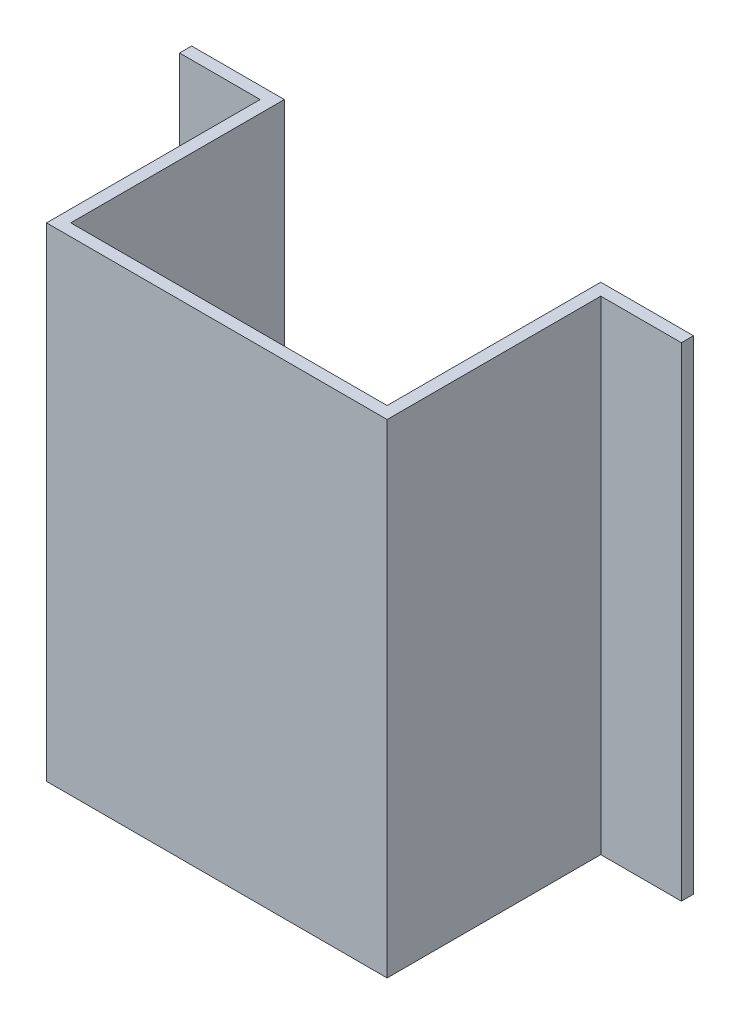
ISO-10303-21;
HEADER;
FILE_DESCRIPTION(('STEP AP214'),'2;1');
FILE_NAME('part.step','',(''),(''),'','','');
FILE_SCHEMA(('AUTOMOTIVE_DESIGN { 1 0 10303 214 1 1 1 1 }'));
ENDSEC;
DATA;
#1=APPLICATION_CONTEXT('core data for automotive mechanical design processes');
#2=APPLICATION_PROTOCOL_DEFINITION('international standard','automotive_design',2000,#1);
#3=PRODUCT_CONTEXT('',#1,'mechanical');
#4=PRODUCT('Part','Part','',(#3));
#5=PRODUCT_RELATED_PRODUCT_CATEGORY('part','',(#4));
#6=PRODUCT_DEFINITION_FORMATION('','',#4);
#7=PRODUCT_DEFINITION_CONTEXT('part definition',#1,'design');
#8=PRODUCT_DEFINITION('design','',#6,#7);
#9=PRODUCT_DEFINITION_SHAPE('','',#8);
#10=(LENGTH_UNIT() NAMED_UNIT(*) SI_UNIT(.MILLI.,.METRE.));
#11=(NAMED_UNIT(*) PLANE_ANGLE_UNIT() SI_UNIT($,.RADIAN.));
#12=(NAMED_UNIT(*) SI_UNIT($,.STERADIAN.) SOLID_ANGLE_UNIT());
#13=UNCERTAINTY_MEASURE_WITH_UNIT(LENGTH_MEASURE(1.E-05),#10,'distance_accuracy_value','');
#14=(GEOMETRIC_REPRESENTATION_CONTEXT(3) GLOBAL_UNCERTAINTY_ASSIGNED_CONTEXT((#13)) GLOBAL_UNIT_ASSIGNED_CONTEXT((#10,
#11,#12)) REPRESENTATION_CONTEXT('',''));
#15=CARTESIAN_POINT('',(0.,0.,0.));
#16=DIRECTION('',(0.,0.,1.));
#17=DIRECTION('',(1.,0.,0.));
#18=AXIS2_PLACEMENT_3D('',#15,#16,#17);
#19=CARTESIAN_POINT('',(-42.25,60.,56.));
#20=DIRECTION('',(1.,0.,0.));
#21=DIRECTION('',(0.,1.,0.));
#22=AXIS2_PLACEMENT_3D('',#19,#20,#21);
#23=PLANE('',#22);
#24=DIRECTION('',(0.,1.,0.));
#25=VECTOR('',#24,1.);
#26=CARTESIAN_POINT('',(-42.25,60.,3.));
#27=LINE('',#26,#25);
#28=CARTESIAN_POINT('',(-42.25,-60.,3.00000000000001));
#29=VERTEX_POINT('',#28);
#30=CARTESIAN_POINT('',(-42.25,60.,3.));
#31=VERTEX_POINT('',#30);
#32=EDGE_CURVE('E57',#29,#31,#27,.T.);
#33=ORIENTED_EDGE('',*,*,#32,.F.);
#34=DIRECTION('',(0.,0.,-1.));
#35=VECTOR('',#34,1.);
#36=CARTESIAN_POINT('',(-42.25,-60.,56.));
#37=LINE('',#36,#35);
#38=CARTESIAN_POINT('',(-42.25,-60.,56.));
#39=VERTEX_POINT('',#38);
#40=EDGE_CURVE('E215',#39,#29,#37,.T.);
#41=ORIENTED_EDGE('',*,*,#40,.F.);
#42=DIRECTION('',(0.,-1.,0.));
#43=VECTOR('',#42,1.);
#44=CARTESIAN_POINT('',(-42.25,60.,56.));
#45=LINE('',#44,#43);
#46=CARTESIAN_POINT('',(-42.25,60.,56.));
#47=VERTEX_POINT('',#46);
#48=EDGE_CURVE('E206',#47,#39,#45,.T.);
#49=ORIENTED_EDGE('',*,*,#48,.F.);
#50=DIRECTION('',(0.,0.,-1.));
#51=VECTOR('',#50,1.);
#52=CARTESIAN_POINT('',(-42.25,60.,56.));
#53=LINE('',#52,#51);
#54=EDGE_CURVE('E42',#47,#31,#53,.T.);
#55=ORIENTED_EDGE('',*,*,#54,.T.);
#56=EDGE_LOOP('',(#33,#41,#49,#55));
#57=FACE_BOUND('',#56,.T.);
#58=ADVANCED_FACE('F34',(#57),#23,.F.);
#59=CARTESIAN_POINT('',(0.,0.,0.));
#60=DIRECTION('',(0.,0.,1.));
#61=DIRECTION('',(1.,0.,0.));
#62=AXIS2_PLACEMENT_3D('',#59,#60,#61);
#63=PLANE('',#62);
#64=DIRECTION('',(-1.,0.,0.));
#65=VECTOR('',#64,1.);
#66=CARTESIAN_POINT('',(-42.25,60.,0.));
#67=LINE('',#66,#65);
#68=CARTESIAN_POINT('',(-39.25,60.,0.));
#69=VERTEX_POINT('',#68);
#70=CARTESIAN_POINT('',(-62.25,60.,0.));
#71=VERTEX_POINT('',#70);
#72=EDGE_CURVE('E137',#69,#71,#67,.T.);
#73=ORIENTED_EDGE('',*,*,#72,.F.);
#74=DIRECTION('',(0.,1.,0.));
#75=VECTOR('',#74,1.);
#76=CARTESIAN_POINT('',(-39.25,-60.,0.));
#77=LINE('',#76,#75);
#78=CARTESIAN_POINT('',(-39.25,-60.,0.));
#79=VERTEX_POINT('',#78);
#80=EDGE_CURVE('E194',#79,#69,#77,.T.);
#81=ORIENTED_EDGE('',*,*,#80,.F.);
#82=DIRECTION('',(1.,0.,0.));
#83=VECTOR('',#82,1.);
#84=CARTESIAN_POINT('',(-42.25,-60.,0.));
#85=LINE('',#84,#83);
#86=CARTESIAN_POINT('',(-62.25,-60.,0.));
#87=VERTEX_POINT('',#86);
#88=EDGE_CURVE('E204',#87,#79,#85,.T.);
#89=ORIENTED_EDGE('',*,*,#88,.F.);
#90=DIRECTION('',(0.,-1.,0.));
#91=VECTOR('',#90,1.);
#92=CARTESIAN_POINT('',(-62.25,60.,0.));
#93=LINE('',#92,#91);
#94=EDGE_CURVE('E159',#71,#87,#93,.T.);
#95=ORIENTED_EDGE('',*,*,#94,.F.);
#96=EDGE_LOOP('',(#73,#81,#89,#95));
#97=FACE_BOUND('',#96,.T.);
#98=ADVANCED_FACE('F230',(#97),#63,.F.);
#99=CARTESIAN_POINT('',(42.25,60.,56.));
#100=DIRECTION('',(-1.,0.,0.));
#101=DIRECTION('',(0.,-1.,0.));
#102=AXIS2_PLACEMENT_3D('',#99,#100,#101);
#103=PLANE('',#102);
#104=DIRECTION('',(0.,0.,-1.));
#105=VECTOR('',#104,1.);
#106=CARTESIAN_POINT('',(42.25,-60.,56.));
#107=LINE('',#106,#105);
#108=CARTESIAN_POINT('',(42.25,-60.,56.));
#109=VERTEX_POINT('',#108);
#110=CARTESIAN_POINT('',(42.25,-60.,3.00000000000002));
#111=VERTEX_POINT('',#110);
#112=EDGE_CURVE('E209',#109,#111,#107,.T.);
#113=ORIENTED_EDGE('',*,*,#112,.T.);
#114=DIRECTION('',(0.,1.,0.));
#115=VECTOR('',#114,1.);
#116=CARTESIAN_POINT('',(42.25,60.,3.));
#117=LINE('',#116,#115);
#118=CARTESIAN_POINT('',(42.25,60.,3.00000000000001));
#119=VERTEX_POINT('',#118);
#120=EDGE_CURVE('E146',#111,#119,#117,.T.);
#121=ORIENTED_EDGE('',*,*,#120,.T.);
#122=DIRECTION('',(0.,0.,-1.));
#123=VECTOR('',#122,1.);
#124=CARTESIAN_POINT('',(42.25,60.,56.));
#125=LINE('',#124,#123);
#126=CARTESIAN_POINT('',(42.25,60.,56.));
#127=VERTEX_POINT('',#126);
#128=EDGE_CURVE('E11',#127,#119,#125,.T.);
#129=ORIENTED_EDGE('',*,*,#128,.F.);
#130=DIRECTION('',(0.,1.,0.));
#131=VECTOR('',#130,1.);
#132=CARTESIAN_POINT('',(42.25,60.,56.));
#133=LINE('',#132,#131);
#134=EDGE_CURVE('E200',#109,#127,#133,.T.);
#135=ORIENTED_EDGE('',*,*,#134,.F.);
#136=EDGE_LOOP('',(#113,#121,#129,#135));
#137=FACE_BOUND('',#136,.T.);
#138=ADVANCED_FACE('F36',(#137),#103,.F.);
#139=CARTESIAN_POINT('',(-42.25,60.,56.));
#140=DIRECTION('',(0.,-1.,0.));
#141=DIRECTION('',(0.,0.,-1.));
#142=AXIS2_PLACEMENT_3D('',#139,#140,#141);
#143=PLANE('',#142);
#144=DIRECTION('',(1.,0.,0.));
#145=VECTOR('',#144,1.);
#146=CARTESIAN_POINT('',(-39.25,60.,53.));
#147=LINE('',#146,#145);
#148=CARTESIAN_POINT('',(-39.25,60.,53.));
#149=VERTEX_POINT('',#148);
#150=CARTESIAN_POINT('',(39.25,60.,53.));
#151=VERTEX_POINT('',#150);
#152=EDGE_CURVE('E190',#149,#151,#147,.T.);
#153=ORIENTED_EDGE('',*,*,#152,.F.);
#154=DIRECTION('',(0.,0.,1.));
#155=VECTOR('',#154,1.);
#156=CARTESIAN_POINT('',(-39.25,60.,0.));
#157=LINE('',#156,#155);
#158=EDGE_CURVE('E176',#69,#149,#157,.T.);
#159=ORIENTED_EDGE('',*,*,#158,.F.);
#160=ORIENTED_EDGE('',*,*,#72,.T.);
#161=DIRECTION('',(0.,0.,-1.));
#162=VECTOR('',#161,1.);
#163=CARTESIAN_POINT('',(-62.25,60.,0.));
#164=LINE('',#163,#162);
#165=CARTESIAN_POINT('',(-62.25,60.,3.));
#166=VERTEX_POINT('',#165);
#167=EDGE_CURVE('E166',#166,#71,#164,.T.);
#168=ORIENTED_EDGE('',*,*,#167,.F.);
#169=DIRECTION('',(1.,0.,0.));
#170=VECTOR('',#169,1.);
#171=CARTESIAN_POINT('',(-62.25,60.,3.));
#172=LINE('',#171,#170);
#173=EDGE_CURVE('E169',#166,#31,#172,.T.);
#174=ORIENTED_EDGE('',*,*,#173,.T.);
#175=ORIENTED_EDGE('',*,*,#54,.F.);
#176=DIRECTION('',(-1.,0.,0.));
#177=VECTOR('',#176,1.);
#178=CARTESIAN_POINT('',(-42.25,60.,56.));
#179=LINE('',#178,#177);
#180=EDGE_CURVE('E203',#127,#47,#179,.T.);
#181=ORIENTED_EDGE('',*,*,#180,.F.);
#182=ORIENTED_EDGE('',*,*,#128,.T.);
#183=DIRECTION('',(-1.,0.,0.));
#184=VECTOR('',#183,1.);
#185=CARTESIAN_POINT('',(62.25,60.,3.));
#186=LINE('',#185,#184);
#187=CARTESIAN_POINT('',(62.25,60.,3.));
#188=VERTEX_POINT('',#187);
#189=EDGE_CURVE('E49',#188,#119,#186,.T.);
#190=ORIENTED_EDGE('',*,*,#189,.F.);
#191=DIRECTION('',(0.,0.,-1.));
#192=VECTOR('',#191,1.);
#193=CARTESIAN_POINT('',(62.25,60.,0.));
#194=LINE('',#193,#192);
#195=CARTESIAN_POINT('',(62.25,60.,0.));
#196=VERTEX_POINT('',#195);
#197=EDGE_CURVE('E143',#188,#196,#194,.T.);
#198=ORIENTED_EDGE('',*,*,#197,.T.);
#199=CARTESIAN_POINT('',(39.25,60.,0.));
#200=VERTEX_POINT('',#199);
#201=EDGE_CURVE('E126',#196,#200,#67,.T.);
#202=ORIENTED_EDGE('',*,*,#201,.T.);
#203=DIRECTION('',(0.,0.,-1.));
#204=VECTOR('',#203,1.);
#205=CARTESIAN_POINT('',(39.25,60.,0.));
#206=LINE('',#205,#204);
#207=EDGE_CURVE('E181',#151,#200,#206,.T.);
#208=ORIENTED_EDGE('',*,*,#207,.F.);
#209=EDGE_LOOP('',(#153,#159,#160,#168,#174,#175,#181,#182,#190,#198,#202,#208));
#210=FACE_BOUND('',#209,.T.);
#211=ADVANCED_FACE('F149',(#210),#143,.F.);
#212=CARTESIAN_POINT('',(-42.25,-60.,56.));
#213=DIRECTION('',(0.,1.,0.));
#214=DIRECTION('',(0.,0.,1.));
#215=AXIS2_PLACEMENT_3D('',#212,#213,#214);
#216=PLANE('',#215);
#217=ORIENTED_EDGE('',*,*,#88,.T.);
#218=DIRECTION('',(0.,0.,1.));
#219=VECTOR('',#218,1.);
#220=CARTESIAN_POINT('',(-39.25,-60.,0.));
#221=LINE('',#220,#219);
#222=CARTESIAN_POINT('',(-39.25,-60.,53.));
#223=VERTEX_POINT('',#222);
#224=EDGE_CURVE('E177',#79,#223,#221,.T.);
#225=ORIENTED_EDGE('',*,*,#224,.T.);
#226=DIRECTION('',(1.,0.,0.));
#227=VECTOR('',#226,1.);
#228=CARTESIAN_POINT('',(-39.25,-60.,53.));
#229=LINE('',#228,#227);
#230=CARTESIAN_POINT('',(39.25,-60.,53.));
#231=VERTEX_POINT('',#230);
#232=EDGE_CURVE('E180',#223,#231,#229,.T.);
#233=ORIENTED_EDGE('',*,*,#232,.T.);
#234=DIRECTION('',(0.,0.,-1.));
#235=VECTOR('',#234,1.);
#236=CARTESIAN_POINT('',(39.25,-60.,0.));
#237=LINE('',#236,#235);
#238=CARTESIAN_POINT('',(39.25,-60.,0.));
#239=VERTEX_POINT('',#238);
#240=EDGE_CURVE('E184',#231,#239,#237,.T.);
#241=ORIENTED_EDGE('',*,*,#240,.T.);
#242=CARTESIAN_POINT('',(62.25,-60.,0.));
#243=VERTEX_POINT('',#242);
#244=EDGE_CURVE('E136',#239,#243,#85,.T.);
#245=ORIENTED_EDGE('',*,*,#244,.T.);
#246=DIRECTION('',(0.,0.,1.));
#247=VECTOR('',#246,1.);
#248=CARTESIAN_POINT('',(62.25,-60.,0.));
#249=LINE('',#248,#247);
#250=CARTESIAN_POINT('',(62.25,-60.,3.00000000000002));
#251=VERTEX_POINT('',#250);
#252=EDGE_CURVE('E145',#243,#251,#249,.T.);
#253=ORIENTED_EDGE('',*,*,#252,.T.);
#254=DIRECTION('',(-1.,0.,0.));
#255=VECTOR('',#254,1.);
#256=CARTESIAN_POINT('',(62.25,-60.,3.00000000000002));
#257=LINE('',#256,#255);
#258=EDGE_CURVE('E155',#251,#111,#257,.T.);
#259=ORIENTED_EDGE('',*,*,#258,.T.);
#260=ORIENTED_EDGE('',*,*,#112,.F.);
#261=DIRECTION('',(1.,0.,0.));
#262=VECTOR('',#261,1.);
#263=CARTESIAN_POINT('',(-42.25,-60.,56.));
#264=LINE('',#263,#262);
#265=EDGE_CURVE('E208',#39,#109,#264,.T.);
#266=ORIENTED_EDGE('',*,*,#265,.F.);
#267=ORIENTED_EDGE('',*,*,#40,.T.);
#268=DIRECTION('',(1.,0.,0.));
#269=VECTOR('',#268,1.);
#270=CARTESIAN_POINT('',(-62.25,-60.,3.00000000000002));
#271=LINE('',#270,#269);
#272=CARTESIAN_POINT('',(-62.25,-60.,3.00000000000002));
#273=VERTEX_POINT('',#272);
#274=EDGE_CURVE('E173',#273,#29,#271,.T.);
#275=ORIENTED_EDGE('',*,*,#274,.F.);
#276=DIRECTION('',(0.,0.,1.));
#277=VECTOR('',#276,1.);
#278=CARTESIAN_POINT('',(-62.25,-60.,0.));
#279=LINE('',#278,#277);
#280=EDGE_CURVE('E162',#87,#273,#279,.T.);
#281=ORIENTED_EDGE('',*,*,#280,.F.);
#282=EDGE_LOOP('',(#217,#225,#233,#241,#245,#253,#259,#260,#266,#267,#275,#281));
#283=FACE_BOUND('',#282,.T.);
#284=ADVANCED_FACE('F234',(#283),#216,.F.);
#285=CARTESIAN_POINT('',(0.,0.,56.));
#286=DIRECTION('',(0.,0.,1.));
#287=DIRECTION('',(1.,0.,0.));
#288=AXIS2_PLACEMENT_3D('',#285,#286,#287);
#289=PLANE('',#288);
#290=ORIENTED_EDGE('',*,*,#134,.T.);
#291=ORIENTED_EDGE('',*,*,#180,.T.);
#292=ORIENTED_EDGE('',*,*,#48,.T.);
#293=ORIENTED_EDGE('',*,*,#265,.T.);
#294=EDGE_LOOP('',(#290,#291,#292,#293));
#295=FACE_BOUND('',#294,.T.);
#296=ADVANCED_FACE('F239',(#295),#289,.T.);
#297=ORIENTED_EDGE('',*,*,#244,.F.);
#298=DIRECTION('',(0.,1.,0.));
#299=VECTOR('',#298,1.);
#300=CARTESIAN_POINT('',(39.25,-60.,0.));
#301=LINE('',#300,#299);
#302=EDGE_CURVE('E132',#239,#200,#301,.T.);
#303=ORIENTED_EDGE('',*,*,#302,.T.);
#304=ORIENTED_EDGE('',*,*,#201,.F.);
#305=DIRECTION('',(0.,-1.,0.));
#306=VECTOR('',#305,1.);
#307=CARTESIAN_POINT('',(62.25,60.,0.));
#308=LINE('',#307,#306);
#309=EDGE_CURVE('E130',#196,#243,#308,.T.);
#310=ORIENTED_EDGE('',*,*,#309,.T.);
#311=EDGE_LOOP('',(#297,#303,#304,#310));
#312=FACE_BOUND('',#311,.T.);
#313=ADVANCED_FACE('F129',(#312),#63,.F.);
#314=CARTESIAN_POINT('',(-39.25,-60.,0.));
#315=DIRECTION('',(-1.,0.,0.));
#316=DIRECTION('',(0.,0.,1.));
#317=AXIS2_PLACEMENT_3D('',#314,#315,#316);
#318=PLANE('',#317);
#319=ORIENTED_EDGE('',*,*,#158,.T.);
#320=DIRECTION('',(0.,1.,0.));
#321=VECTOR('',#320,1.);
#322=CARTESIAN_POINT('',(-39.25,-60.,53.));
#323=LINE('',#322,#321);
#324=EDGE_CURVE('E187',#223,#149,#323,.T.);
#325=ORIENTED_EDGE('',*,*,#324,.F.);
#326=ORIENTED_EDGE('',*,*,#224,.F.);
#327=ORIENTED_EDGE('',*,*,#80,.T.);
#328=EDGE_LOOP('',(#319,#325,#326,#327));
#329=FACE_BOUND('',#328,.T.);
#330=ADVANCED_FACE('F250',(#329),#318,.F.);
#331=CARTESIAN_POINT('',(39.25,-60.,0.));
#332=DIRECTION('',(1.,0.,0.));
#333=DIRECTION('',(0.,0.,-1.));
#334=AXIS2_PLACEMENT_3D('',#331,#332,#333);
#335=PLANE('',#334);
#336=ORIENTED_EDGE('',*,*,#207,.T.);
#337=ORIENTED_EDGE('',*,*,#302,.F.);
#338=ORIENTED_EDGE('',*,*,#240,.F.);
#339=DIRECTION('',(0.,1.,0.));
#340=VECTOR('',#339,1.);
#341=CARTESIAN_POINT('',(39.25,-60.,53.));
#342=LINE('',#341,#340);
#343=EDGE_CURVE('E197',#231,#151,#342,.T.);
#344=ORIENTED_EDGE('',*,*,#343,.T.);
#345=EDGE_LOOP('',(#336,#337,#338,#344));
#346=FACE_BOUND('',#345,.T.);
#347=ADVANCED_FACE('F246',(#346),#335,.F.);
#348=CARTESIAN_POINT('',(-39.25,-60.,53.));
#349=DIRECTION('',(0.,0.,1.));
#350=DIRECTION('',(1.,0.,0.));
#351=AXIS2_PLACEMENT_3D('',#348,#349,#350);
#352=PLANE('',#351);
#353=ORIENTED_EDGE('',*,*,#152,.T.);
#354=ORIENTED_EDGE('',*,*,#343,.F.);
#355=ORIENTED_EDGE('',*,*,#232,.F.);
#356=ORIENTED_EDGE('',*,*,#324,.T.);
#357=EDGE_LOOP('',(#353,#354,#355,#356));
#358=FACE_BOUND('',#357,.T.);
#359=ADVANCED_FACE('F248',(#358),#352,.F.);
#360=CARTESIAN_POINT('',(-62.25,60.,3.));
#361=DIRECTION('',(0.,0.,-1.));
#362=DIRECTION('',(0.,1.,0.));
#363=AXIS2_PLACEMENT_3D('',#360,#361,#362);
#364=PLANE('',#363);
#365=ORIENTED_EDGE('',*,*,#32,.T.);
#366=ORIENTED_EDGE('',*,*,#173,.F.);
#367=DIRECTION('',(0.,1.,0.));
#368=VECTOR('',#367,1.);
#369=CARTESIAN_POINT('',(-62.25,60.,3.));
#370=LINE('',#369,#368);
#371=EDGE_CURVE('E164',#273,#166,#370,.T.);
#372=ORIENTED_EDGE('',*,*,#371,.F.);
#373=ORIENTED_EDGE('',*,*,#274,.T.);
#374=EDGE_LOOP('',(#365,#366,#372,#373));
#375=FACE_BOUND('',#374,.T.);
#376=ADVANCED_FACE('F220',(#375),#364,.F.);
#377=CARTESIAN_POINT('',(-62.25,0.,0.));
#378=DIRECTION('',(-1.,0.,0.));
#379=DIRECTION('',(0.,-1.,0.));
#380=AXIS2_PLACEMENT_3D('',#377,#378,#379);
#381=PLANE('',#380);
#382=ORIENTED_EDGE('',*,*,#94,.T.);
#383=ORIENTED_EDGE('',*,*,#280,.T.);
#384=ORIENTED_EDGE('',*,*,#371,.T.);
#385=ORIENTED_EDGE('',*,*,#167,.T.);
#386=EDGE_LOOP('',(#382,#383,#384,#385));
#387=FACE_BOUND('',#386,.T.);
#388=ADVANCED_FACE('F228',(#387),#381,.T.);
#389=CARTESIAN_POINT('',(62.25,60.,3.));
#390=DIRECTION('',(0.,0.,1.));
#391=DIRECTION('',(0.,-1.,0.));
#392=AXIS2_PLACEMENT_3D('',#389,#390,#391);
#393=PLANE('',#392);
#394=ORIENTED_EDGE('',*,*,#120,.F.);
#395=ORIENTED_EDGE('',*,*,#258,.F.);
#396=DIRECTION('',(0.,1.,0.));
#397=VECTOR('',#396,1.);
#398=CARTESIAN_POINT('',(62.25,60.,3.));
#399=LINE('',#398,#397);
#400=EDGE_CURVE('E150',#251,#188,#399,.T.);
#401=ORIENTED_EDGE('',*,*,#400,.T.);
#402=ORIENTED_EDGE('',*,*,#189,.T.);
#403=EDGE_LOOP('',(#394,#395,#401,#402));
#404=FACE_BOUND('',#403,.T.);
#405=ADVANCED_FACE('F242',(#404),#393,.T.);
#406=CARTESIAN_POINT('',(62.25,0.,0.));
#407=DIRECTION('',(1.,0.,0.));
#408=DIRECTION('',(0.,-1.,0.));
#409=AXIS2_PLACEMENT_3D('',#406,#407,#408);
#410=PLANE('',#409);
#411=ORIENTED_EDGE('',*,*,#309,.F.);
#412=ORIENTED_EDGE('',*,*,#197,.F.);
#413=ORIENTED_EDGE('',*,*,#400,.F.);
#414=ORIENTED_EDGE('',*,*,#252,.F.);
#415=EDGE_LOOP('',(#411,#412,#413,#414));
#416=FACE_BOUND('',#415,.T.);
#417=ADVANCED_FACE('F141',(#416),#410,.T.);
#418=CLOSED_SHELL('',(#58,#98,#138,#211,#284,#296,#313,#330,#347,#359,#376,#388,#405,#417));
#419=MANIFOLD_SOLID_BREP('B2',#418);
#420=ADVANCED_BREP_SHAPE_REPRESENTATION('',(#18,#419),#14);
#421=SHAPE_DEFINITION_REPRESENTATION(#9,#420);
ENDSEC;
END-ISO-10303-21;
